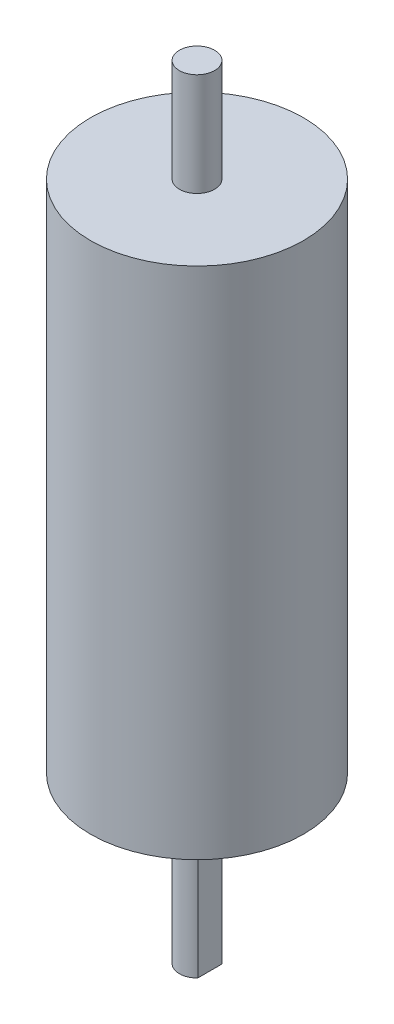
ISO-10303-21;
HEADER;
FILE_DESCRIPTION(('STEP AP214'),'2;1');
FILE_NAME('part.step','',(''),(''),'','','');
FILE_SCHEMA(('AUTOMOTIVE_DESIGN { 1 0 10303 214 1 1 1 1 }'));
ENDSEC;
DATA;
#1=APPLICATION_CONTEXT('core data for automotive mechanical design processes');
#2=APPLICATION_PROTOCOL_DEFINITION('international standard','automotive_design',2000,#1);
#3=PRODUCT_CONTEXT('',#1,'mechanical');
#4=PRODUCT('Part','Part','',(#3));
#5=PRODUCT_RELATED_PRODUCT_CATEGORY('part','',(#4));
#6=PRODUCT_DEFINITION_FORMATION('','',#4);
#7=PRODUCT_DEFINITION_CONTEXT('part definition',#1,'design');
#8=PRODUCT_DEFINITION('design','',#6,#7);
#9=PRODUCT_DEFINITION_SHAPE('','',#8);
#10=(LENGTH_UNIT() NAMED_UNIT(*) SI_UNIT(.MILLI.,.METRE.));
#11=(NAMED_UNIT(*) PLANE_ANGLE_UNIT() SI_UNIT($,.RADIAN.));
#12=(NAMED_UNIT(*) SI_UNIT($,.STERADIAN.) SOLID_ANGLE_UNIT());
#13=UNCERTAINTY_MEASURE_WITH_UNIT(LENGTH_MEASURE(1.E-05),#10,'distance_accuracy_value','');
#14=(GEOMETRIC_REPRESENTATION_CONTEXT(3) GLOBAL_UNCERTAINTY_ASSIGNED_CONTEXT((#13)) GLOBAL_UNIT_ASSIGNED_CONTEXT((#10,
#11,#12)) REPRESENTATION_CONTEXT('',''));
#15=CARTESIAN_POINT('',(0.,0.,0.));
#16=DIRECTION('',(0.,0.,1.));
#17=DIRECTION('',(1.,0.,0.));
#18=AXIS2_PLACEMENT_3D('',#15,#16,#17);
#19=CARTESIAN_POINT('',(0.,-43.,0.));
#20=DIRECTION('',(0.,1.,0.));
#21=DIRECTION('',(0.,0.,1.));
#22=AXIS2_PLACEMENT_3D('',#19,#20,#21);
#23=PLANE('',#22);
#24=DIRECTION('',(0.,0.,1.));
#25=VECTOR('',#24,1.);
#26=CARTESIAN_POINT('',(1.75,-43.,1.64240677056568));
#27=LINE('',#26,#25);
#28=CARTESIAN_POINT('',(1.75,-43.,-1.64240677056568));
#29=VERTEX_POINT('',#28);
#30=CARTESIAN_POINT('',(1.75,-43.,1.64240677056568));
#31=VERTEX_POINT('',#30);
#32=EDGE_CURVE('E60',#29,#31,#27,.T.);
#33=ORIENTED_EDGE('',*,*,#32,.F.);
#34=CARTESIAN_POINT('',(0.,-43.,0.));
#35=DIRECTION('',(0.,1.,0.));
#36=DIRECTION('',(0.,0.,1.));
#37=AXIS2_PLACEMENT_3D('',#34,#35,#36);
#38=CIRCLE('',#37,2.4);
#39=EDGE_CURVE('E104',#31,#29,#38,.T.);
#40=ORIENTED_EDGE('',*,*,#39,.F.);
#41=EDGE_LOOP('',(#33,#40));
#42=FACE_BOUND('',#41,.T.);
#43=ADVANCED_FACE('F39',(#42),#23,.F.);
#44=DIRECTION('',(0.,0.,-1.));
#45=VECTOR('',#44,1.);
#46=CARTESIAN_POINT('',(-1.75,-43.,1.64240677056568));
#47=LINE('',#46,#45);
#48=CARTESIAN_POINT('',(-1.75,-43.,1.64240677056568));
#49=VERTEX_POINT('',#48);
#50=CARTESIAN_POINT('',(-1.75,-43.,-1.64240677056568));
#51=VERTEX_POINT('',#50);
#52=EDGE_CURVE('E53',#49,#51,#47,.T.);
#53=ORIENTED_EDGE('',*,*,#52,.F.);
#54=EDGE_CURVE('E102',#51,#49,#38,.T.);
#55=ORIENTED_EDGE('',*,*,#54,.F.);
#56=EDGE_LOOP('',(#53,#55));
#57=FACE_BOUND('',#56,.T.);
#58=ADVANCED_FACE('F133',(#57),#23,.F.);
#59=CARTESIAN_POINT('',(0.,35.,0.));
#60=DIRECTION('',(0.,-1.,0.));
#61=DIRECTION('',(0.,0.,-1.));
#62=AXIS2_PLACEMENT_3D('',#59,#60,#61);
#63=CYLINDRICAL_SURFACE('',#62,14.5);
#64=CARTESIAN_POINT('',(0.,35.,0.));
#65=DIRECTION('',(0.,1.,0.));
#66=DIRECTION('',(0.,0.,1.));
#67=AXIS2_PLACEMENT_3D('',#64,#65,#66);
#68=CIRCLE('',#67,14.5);
#69=CARTESIAN_POINT('',(0.,35.,14.5));
#70=VERTEX_POINT('',#69);
#71=EDGE_CURVE('E47',#70,#70,#68,.T.);
#72=ORIENTED_EDGE('',*,*,#71,.F.);
#73=EDGE_LOOP('',(#72));
#74=FACE_BOUND('',#73,.T.);
#75=CARTESIAN_POINT('',(0.,-35.,0.));
#76=DIRECTION('',(0.,1.,0.));
#77=DIRECTION('',(0.,0.,1.));
#78=AXIS2_PLACEMENT_3D('',#75,#76,#77);
#79=CIRCLE('',#78,14.5);
#80=CARTESIAN_POINT('',(0.,-35.,14.5));
#81=VERTEX_POINT('',#80);
#82=EDGE_CURVE('E113',#81,#81,#79,.T.);
#83=ORIENTED_EDGE('',*,*,#82,.T.);
#84=EDGE_LOOP('',(#83));
#85=FACE_BOUND('',#84,.T.);
#86=ADVANCED_FACE('F41',(#74,#85),#63,.T.);
#87=CARTESIAN_POINT('',(0.,35.,0.));
#88=DIRECTION('',(0.,1.,0.));
#89=DIRECTION('',(0.,0.,1.));
#90=AXIS2_PLACEMENT_3D('',#87,#88,#89);
#91=PLANE('',#90);
#92=CARTESIAN_POINT('',(0.,35.,0.));
#93=DIRECTION('',(0.,1.,0.));
#94=DIRECTION('',(0.,0.,1.));
#95=AXIS2_PLACEMENT_3D('',#92,#93,#94);
#96=CIRCLE('',#95,2.4);
#97=CARTESIAN_POINT('',(0.,35.,2.4));
#98=VERTEX_POINT('',#97);
#99=EDGE_CURVE('E110',#98,#98,#96,.F.);
#100=ORIENTED_EDGE('',*,*,#99,.T.);
#101=EDGE_LOOP('',(#100));
#102=FACE_BOUND('',#101,.T.);
#103=ORIENTED_EDGE('',*,*,#71,.T.);
#104=EDGE_LOOP('',(#103));
#105=FACE_BOUND('',#104,.T.);
#106=ADVANCED_FACE('F121',(#102,#105),#91,.T.);
#107=CARTESIAN_POINT('',(0.,-35.,0.));
#108=DIRECTION('',(0.,1.,0.));
#109=DIRECTION('',(0.,0.,1.));
#110=AXIS2_PLACEMENT_3D('',#107,#108,#109);
#111=PLANE('',#110);
#112=CARTESIAN_POINT('',(0.,-35.,0.));
#113=DIRECTION('',(0.,1.,0.));
#114=DIRECTION('',(0.,0.,1.));
#115=AXIS2_PLACEMENT_3D('',#112,#113,#114);
#116=CIRCLE('',#115,2.4);
#117=CARTESIAN_POINT('',(0.,-35.,2.4));
#118=VERTEX_POINT('',#117);
#119=EDGE_CURVE('E11',#118,#118,#116,.F.);
#120=ORIENTED_EDGE('',*,*,#119,.F.);
#121=EDGE_LOOP('',(#120));
#122=FACE_BOUND('',#121,.T.);
#123=ORIENTED_EDGE('',*,*,#82,.F.);
#124=EDGE_LOOP('',(#123));
#125=FACE_BOUND('',#124,.T.);
#126=ADVANCED_FACE('F119',(#122,#125),#111,.F.);
#127=CARTESIAN_POINT('',(0.,43.,0.));
#128=DIRECTION('',(0.,-1.,0.));
#129=DIRECTION('',(0.,0.,-1.));
#130=AXIS2_PLACEMENT_3D('',#127,#128,#129);
#131=CYLINDRICAL_SURFACE('',#130,2.4);
#132=ORIENTED_EDGE('',*,*,#39,.T.);
#133=DIRECTION('',(0.,1.,0.));
#134=VECTOR('',#133,1.);
#135=CARTESIAN_POINT('',(1.75,-57.5,-1.64240677056568));
#136=LINE('',#135,#134);
#137=CARTESIAN_POINT('',(1.75,-57.5,-1.64240677056568));
#138=VERTEX_POINT('',#137);
#139=EDGE_CURVE('E106',#138,#29,#136,.T.);
#140=ORIENTED_EDGE('',*,*,#139,.F.);
#141=CARTESIAN_POINT('',(0.,-57.5,0.));
#142=DIRECTION('',(0.,-1.,0.));
#143=DIRECTION('',(0.,0.,-1.));
#144=AXIS2_PLACEMENT_3D('',#141,#142,#143);
#145=CIRCLE('',#144,2.4);
#146=CARTESIAN_POINT('',(-1.75,-57.5,-1.64240677056568));
#147=VERTEX_POINT('',#146);
#148=EDGE_CURVE('E89',#147,#138,#145,.T.);
#149=ORIENTED_EDGE('',*,*,#148,.F.);
#150=DIRECTION('',(0.,1.,0.));
#151=VECTOR('',#150,1.);
#152=CARTESIAN_POINT('',(-1.75,-57.5,-1.64240677056568));
#153=LINE('',#152,#151);
#154=EDGE_CURVE('E86',#147,#51,#153,.T.);
#155=ORIENTED_EDGE('',*,*,#154,.T.);
#156=ORIENTED_EDGE('',*,*,#54,.T.);
#157=DIRECTION('',(0.,1.,0.));
#158=VECTOR('',#157,1.);
#159=CARTESIAN_POINT('',(-1.75,-57.5,1.64240677056568));
#160=LINE('',#159,#158);
#161=CARTESIAN_POINT('',(-1.75,-57.5,1.64240677056568));
#162=VERTEX_POINT('',#161);
#163=EDGE_CURVE('E84',#162,#49,#160,.T.);
#164=ORIENTED_EDGE('',*,*,#163,.F.);
#165=CARTESIAN_POINT('',(0.,-57.5,0.));
#166=DIRECTION('',(0.,-1.,0.));
#167=DIRECTION('',(0.,0.,-1.));
#168=AXIS2_PLACEMENT_3D('',#165,#166,#167);
#169=CIRCLE('',#168,2.4);
#170=CARTESIAN_POINT('',(1.75,-57.5,1.64240677056568));
#171=VERTEX_POINT('',#170);
#172=EDGE_CURVE('E90',#171,#162,#169,.T.);
#173=ORIENTED_EDGE('',*,*,#172,.F.);
#174=DIRECTION('',(0.,1.,0.));
#175=VECTOR('',#174,1.);
#176=CARTESIAN_POINT('',(1.75,-57.5,1.64240677056568));
#177=LINE('',#176,#175);
#178=EDGE_CURVE('E158',#171,#31,#177,.T.);
#179=ORIENTED_EDGE('',*,*,#178,.T.);
#180=EDGE_LOOP('',(#132,#140,#149,#155,#156,#164,#173,#179));
#181=FACE_BOUND('',#180,.T.);
#182=ORIENTED_EDGE('',*,*,#119,.T.);
#183=EDGE_LOOP('',(#182));
#184=FACE_BOUND('',#183,.T.);
#185=ADVANCED_FACE('F100',(#181,#184),#131,.T.);
#186=ORIENTED_EDGE('',*,*,#99,.F.);
#187=EDGE_LOOP('',(#186));
#188=FACE_BOUND('',#187,.T.);
#189=CARTESIAN_POINT('',(0.,49.,0.));
#190=DIRECTION('',(0.,1.,0.));
#191=DIRECTION('',(0.,0.,1.));
#192=AXIS2_PLACEMENT_3D('',#189,#190,#191);
#193=CIRCLE('',#192,2.4);
#194=CARTESIAN_POINT('',(0.,49.,2.4));
#195=VERTEX_POINT('',#194);
#196=EDGE_CURVE('E152',#195,#195,#193,.T.);
#197=ORIENTED_EDGE('',*,*,#196,.F.);
#198=EDGE_LOOP('',(#197));
#199=FACE_BOUND('',#198,.T.);
#200=ADVANCED_FACE('F128',(#188,#199),#131,.T.);
#201=CARTESIAN_POINT('',(-1.75,-57.5,1.64240677056568));
#202=DIRECTION('',(1.,0.,0.));
#203=DIRECTION('',(0.,0.,-1.));
#204=AXIS2_PLACEMENT_3D('',#201,#202,#203);
#205=PLANE('',#204);
#206=ORIENTED_EDGE('',*,*,#52,.T.);
#207=ORIENTED_EDGE('',*,*,#154,.F.);
#208=DIRECTION('',(0.,0.,-1.));
#209=VECTOR('',#208,1.);
#210=CARTESIAN_POINT('',(-1.75,-57.5,1.64240677056568));
#211=LINE('',#210,#209);
#212=EDGE_CURVE('E80',#162,#147,#211,.T.);
#213=ORIENTED_EDGE('',*,*,#212,.F.);
#214=ORIENTED_EDGE('',*,*,#163,.T.);
#215=EDGE_LOOP('',(#206,#207,#213,#214));
#216=FACE_BOUND('',#215,.T.);
#217=ADVANCED_FACE('F82',(#216),#205,.F.);
#218=CARTESIAN_POINT('',(1.75,-57.5,1.64240677056568));
#219=DIRECTION('',(-1.,0.,0.));
#220=DIRECTION('',(0.,0.,1.));
#221=AXIS2_PLACEMENT_3D('',#218,#219,#220);
#222=PLANE('',#221);
#223=ORIENTED_EDGE('',*,*,#32,.T.);
#224=ORIENTED_EDGE('',*,*,#178,.F.);
#225=DIRECTION('',(0.,0.,1.));
#226=VECTOR('',#225,1.);
#227=CARTESIAN_POINT('',(1.75,-57.5,1.64240677056568));
#228=LINE('',#227,#226);
#229=EDGE_CURVE('E95',#138,#171,#228,.T.);
#230=ORIENTED_EDGE('',*,*,#229,.F.);
#231=ORIENTED_EDGE('',*,*,#139,.T.);
#232=EDGE_LOOP('',(#223,#224,#230,#231));
#233=FACE_BOUND('',#232,.T.);
#234=ADVANCED_FACE('F147',(#233),#222,.F.);
#235=CARTESIAN_POINT('',(0.,-57.5,0.));
#236=DIRECTION('',(0.,-1.,0.));
#237=DIRECTION('',(0.,0.,-1.));
#238=AXIS2_PLACEMENT_3D('',#235,#236,#237);
#239=PLANE('',#238);
#240=ORIENTED_EDGE('',*,*,#172,.T.);
#241=ORIENTED_EDGE('',*,*,#212,.T.);
#242=ORIENTED_EDGE('',*,*,#148,.T.);
#243=ORIENTED_EDGE('',*,*,#229,.T.);
#244=EDGE_LOOP('',(#240,#241,#242,#243));
#245=FACE_BOUND('',#244,.T.);
#246=ADVANCED_FACE('F93',(#245),#239,.T.);
#247=CARTESIAN_POINT('',(0.,49.,0.));
#248=DIRECTION('',(0.,1.,0.));
#249=DIRECTION('',(0.,0.,1.));
#250=AXIS2_PLACEMENT_3D('',#247,#248,#249);
#251=PLANE('',#250);
#252=ORIENTED_EDGE('',*,*,#196,.T.);
#253=EDGE_LOOP('',(#252));
#254=FACE_BOUND('',#253,.T.);
#255=ADVANCED_FACE('F167',(#254),#251,.T.);
#256=CLOSED_SHELL('',(#43,#58,#86,#106,#126,#185,#200,#217,#234,#246,#255));
#257=MANIFOLD_SOLID_BREP('B2',#256);
#258=ADVANCED_BREP_SHAPE_REPRESENTATION('',(#18,#257),#14);
#259=SHAPE_DEFINITION_REPRESENTATION(#9,#258);
ENDSEC;
END-ISO-10303-21;
